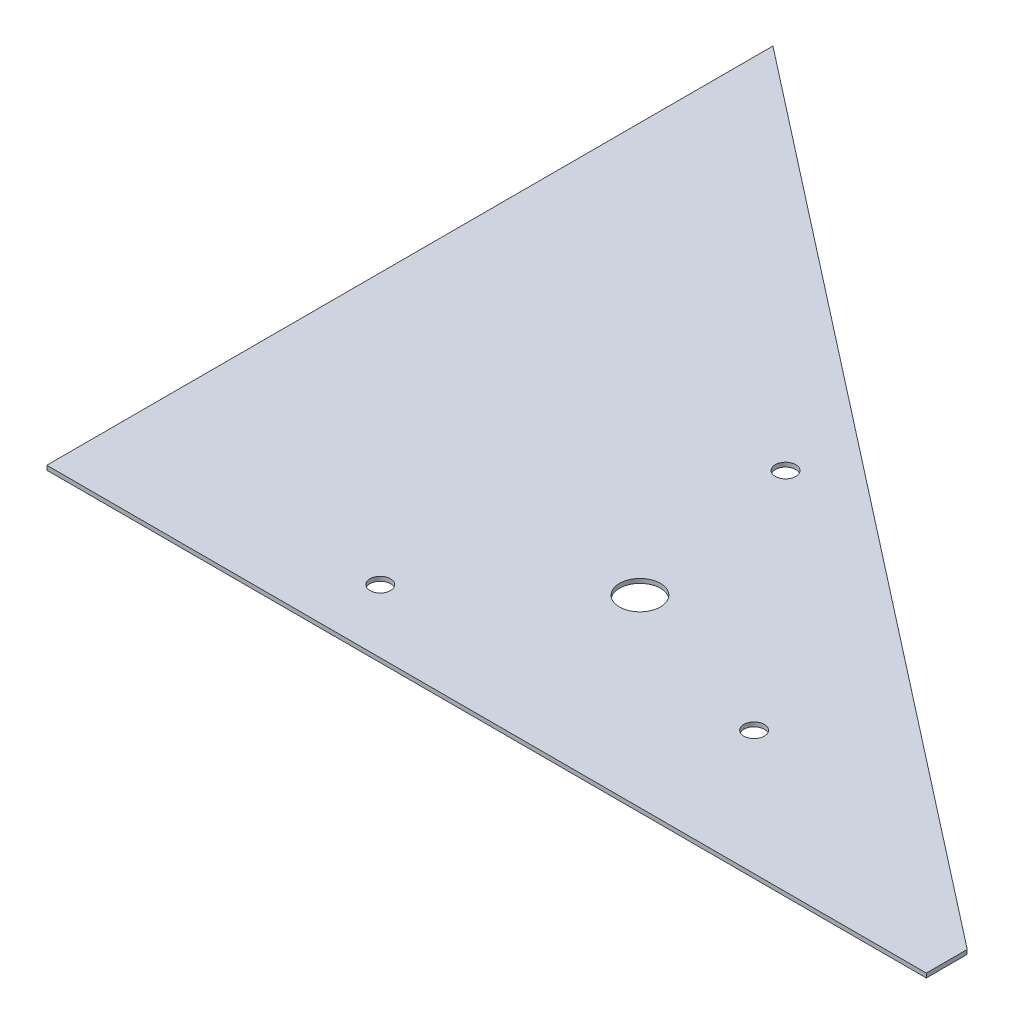
ISO-10303-21;
HEADER;
FILE_DESCRIPTION(('STEP AP214'),'2;1');
FILE_NAME('part.step','',(''),(''),'','','');
FILE_SCHEMA(('AUTOMOTIVE_DESIGN { 1 0 10303 214 1 1 1 1 }'));
ENDSEC;
DATA;
#1=APPLICATION_CONTEXT('core data for automotive mechanical design processes');
#2=APPLICATION_PROTOCOL_DEFINITION('international standard','automotive_design',2000,#1);
#3=PRODUCT_CONTEXT('',#1,'mechanical');
#4=PRODUCT('Part','Part','',(#3));
#5=PRODUCT_RELATED_PRODUCT_CATEGORY('part','',(#4));
#6=PRODUCT_DEFINITION_FORMATION('','',#4);
#7=PRODUCT_DEFINITION_CONTEXT('part definition',#1,'design');
#8=PRODUCT_DEFINITION('design','',#6,#7);
#9=PRODUCT_DEFINITION_SHAPE('','',#8);
#10=(LENGTH_UNIT() NAMED_UNIT(*) SI_UNIT(.MILLI.,.METRE.));
#11=(NAMED_UNIT(*) PLANE_ANGLE_UNIT() SI_UNIT($,.RADIAN.));
#12=(NAMED_UNIT(*) SI_UNIT($,.STERADIAN.) SOLID_ANGLE_UNIT());
#13=UNCERTAINTY_MEASURE_WITH_UNIT(LENGTH_MEASURE(1.E-05),#10,'distance_accuracy_value','');
#14=(GEOMETRIC_REPRESENTATION_CONTEXT(3) GLOBAL_UNCERTAINTY_ASSIGNED_CONTEXT((#13)) GLOBAL_UNIT_ASSIGNED_CONTEXT((#10,
#11,#12)) REPRESENTATION_CONTEXT('',''));
#15=CARTESIAN_POINT('',(0.,0.,0.));
#16=DIRECTION('',(0.,0.,1.));
#17=DIRECTION('',(1.,0.,0.));
#18=AXIS2_PLACEMENT_3D('',#15,#16,#17);
#19=CARTESIAN_POINT('',(546.1,2.65684,-25.4));
#20=DIRECTION('',(-0.614575452616154,0.,0.788858043656556));
#21=DIRECTION('',(0.788858043656556,0.,0.614575452616154));
#22=AXIS2_PLACEMENT_3D('',#19,#20,#21);
#23=PLANE('',#22);
#24=DIRECTION('',(-0.788858043656556,0.,-0.614575452616154));
#25=VECTOR('',#24,1.);
#26=CARTESIAN_POINT('',(546.1,0.,-25.4));
#27=LINE('',#26,#25);
#28=CARTESIAN_POINT('',(546.1,0.,-25.4));
#29=VERTEX_POINT('',#28);
#30=CARTESIAN_POINT('',(0.,0.,-450.85));
#31=VERTEX_POINT('',#30);
#32=EDGE_CURVE('E109',#29,#31,#27,.T.);
#33=ORIENTED_EDGE('',*,*,#32,.T.);
#34=DIRECTION('',(0.,-1.,0.));
#35=VECTOR('',#34,1.);
#36=CARTESIAN_POINT('',(0.,2.65684,-450.85));
#37=LINE('',#36,#35);
#38=CARTESIAN_POINT('',(0.,2.65684,-450.85));
#39=VERTEX_POINT('',#38);
#40=EDGE_CURVE('E11',#39,#31,#37,.T.);
#41=ORIENTED_EDGE('',*,*,#40,.F.);
#42=DIRECTION('',(-0.788858043656556,0.,-0.614575452616154));
#43=VECTOR('',#42,1.);
#44=CARTESIAN_POINT('',(546.1,2.65684,-25.4));
#45=LINE('',#44,#43);
#46=CARTESIAN_POINT('',(546.1,2.65684,-25.4));
#47=VERTEX_POINT('',#46);
#48=EDGE_CURVE('E93',#47,#39,#45,.T.);
#49=ORIENTED_EDGE('',*,*,#48,.F.);
#50=DIRECTION('',(0.,-1.,0.));
#51=VECTOR('',#50,1.);
#52=CARTESIAN_POINT('',(546.1,2.65684,-25.4));
#53=LINE('',#52,#51);
#54=EDGE_CURVE('E105',#47,#29,#53,.T.);
#55=ORIENTED_EDGE('',*,*,#54,.T.);
#56=EDGE_LOOP('',(#33,#41,#49,#55));
#57=FACE_BOUND('',#56,.T.);
#58=ADVANCED_FACE('F39',(#57),#23,.F.);
#59=CARTESIAN_POINT('',(0.,2.65684,-450.85));
#60=DIRECTION('',(1.,0.,0.));
#61=DIRECTION('',(0.,0.,-1.));
#62=AXIS2_PLACEMENT_3D('',#59,#60,#61);
#63=PLANE('',#62);
#64=DIRECTION('',(0.,0.,1.));
#65=VECTOR('',#64,1.);
#66=CARTESIAN_POINT('',(0.,0.,-450.85));
#67=LINE('',#66,#65);
#68=CARTESIAN_POINT('',(0.,0.,0.));
#69=VERTEX_POINT('',#68);
#70=EDGE_CURVE('E98',#31,#69,#67,.T.);
#71=ORIENTED_EDGE('',*,*,#70,.T.);
#72=DIRECTION('',(0.,-1.,0.));
#73=VECTOR('',#72,1.);
#74=CARTESIAN_POINT('',(0.,2.65684,0.));
#75=LINE('',#74,#73);
#76=CARTESIAN_POINT('',(0.,2.65684,0.));
#77=VERTEX_POINT('',#76);
#78=EDGE_CURVE('E48',#77,#69,#75,.T.);
#79=ORIENTED_EDGE('',*,*,#78,.F.);
#80=DIRECTION('',(0.,0.,1.));
#81=VECTOR('',#80,1.);
#82=CARTESIAN_POINT('',(0.,2.65684,-450.85));
#83=LINE('',#82,#81);
#84=EDGE_CURVE('E88',#39,#77,#83,.T.);
#85=ORIENTED_EDGE('',*,*,#84,.F.);
#86=ORIENTED_EDGE('',*,*,#40,.T.);
#87=EDGE_LOOP('',(#71,#79,#85,#86));
#88=FACE_BOUND('',#87,.T.);
#89=ADVANCED_FACE('F97',(#88),#63,.F.);
#90=CARTESIAN_POINT('',(0.,2.65684,0.));
#91=DIRECTION('',(0.,0.,-1.));
#92=DIRECTION('',(-1.,0.,0.));
#93=AXIS2_PLACEMENT_3D('',#90,#91,#92);
#94=PLANE('',#93);
#95=DIRECTION('',(1.,0.,0.));
#96=VECTOR('',#95,1.);
#97=CARTESIAN_POINT('',(0.,0.,0.));
#98=LINE('',#97,#96);
#99=CARTESIAN_POINT('',(546.1,0.,0.));
#100=VERTEX_POINT('',#99);
#101=EDGE_CURVE('E74',#69,#100,#98,.T.);
#102=ORIENTED_EDGE('',*,*,#101,.T.);
#103=DIRECTION('',(0.,-1.,0.));
#104=VECTOR('',#103,1.);
#105=CARTESIAN_POINT('',(546.1,2.65684,0.));
#106=LINE('',#105,#104);
#107=CARTESIAN_POINT('',(546.1,2.65684,0.));
#108=VERTEX_POINT('',#107);
#109=EDGE_CURVE('E99',#108,#100,#106,.T.);
#110=ORIENTED_EDGE('',*,*,#109,.F.);
#111=DIRECTION('',(1.,0.,0.));
#112=VECTOR('',#111,1.);
#113=CARTESIAN_POINT('',(0.,2.65684,0.));
#114=LINE('',#113,#112);
#115=EDGE_CURVE('E91',#77,#108,#114,.T.);
#116=ORIENTED_EDGE('',*,*,#115,.F.);
#117=ORIENTED_EDGE('',*,*,#78,.T.);
#118=EDGE_LOOP('',(#102,#110,#116,#117));
#119=FACE_BOUND('',#118,.T.);
#120=ADVANCED_FACE('F100',(#119),#94,.F.);
#121=CARTESIAN_POINT('',(546.1,2.65684,0.));
#122=DIRECTION('',(-1.,0.,0.));
#123=DIRECTION('',(0.,0.,1.));
#124=AXIS2_PLACEMENT_3D('',#121,#122,#123);
#125=PLANE('',#124);
#126=DIRECTION('',(0.,0.,-1.));
#127=VECTOR('',#126,1.);
#128=CARTESIAN_POINT('',(546.1,0.,0.));
#129=LINE('',#128,#127);
#130=EDGE_CURVE('E80',#100,#29,#129,.T.);
#131=ORIENTED_EDGE('',*,*,#130,.T.);
#132=ORIENTED_EDGE('',*,*,#54,.F.);
#133=DIRECTION('',(0.,0.,-1.));
#134=VECTOR('',#133,1.);
#135=CARTESIAN_POINT('',(546.1,2.65684,0.));
#136=LINE('',#135,#134);
#137=EDGE_CURVE('E56',#108,#47,#136,.T.);
#138=ORIENTED_EDGE('',*,*,#137,.F.);
#139=ORIENTED_EDGE('',*,*,#109,.T.);
#140=EDGE_LOOP('',(#131,#132,#138,#139));
#141=FACE_BOUND('',#140,.T.);
#142=ADVANCED_FACE('F119',(#141),#125,.F.);
#143=CARTESIAN_POINT('',(0.,2.65684,0.));
#144=DIRECTION('',(0.,1.,0.));
#145=DIRECTION('',(0.,0.,1.));
#146=AXIS2_PLACEMENT_3D('',#143,#144,#145);
#147=PLANE('',#146);
#148=CARTESIAN_POINT('',(232.190531828462,2.65684,-226.499987068068));
#149=DIRECTION('',(0.,1.,0.));
#150=DIRECTION('',(0.,0.,1.));
#151=AXIS2_PLACEMENT_3D('',#148,#149,#150);
#152=CIRCLE('',#151,6.34999999999998);
#153=CARTESIAN_POINT('',(232.190531828462,2.65684,-220.149987068068));
#154=VERTEX_POINT('',#153);
#155=EDGE_CURVE('E150',#154,#154,#152,.T.);
#156=ORIENTED_EDGE('',*,*,#155,.F.);
#157=EDGE_LOOP('',(#156));
#158=FACE_BOUND('',#157,.T.);
#159=CARTESIAN_POINT('',(167.736694980537,2.65684,-39.3124529863857));
#160=DIRECTION('',(0.,1.,0.));
#161=DIRECTION('',(0.,0.,1.));
#162=AXIS2_PLACEMENT_3D('',#159,#160,#161);
#163=CIRCLE('',#162,6.35000000000006);
#164=CARTESIAN_POINT('',(167.736694980537,2.65684,-32.9624529863856));
#165=VERTEX_POINT('',#164);
#166=EDGE_CURVE('E142',#165,#165,#163,.T.);
#167=ORIENTED_EDGE('',*,*,#166,.F.);
#168=EDGE_LOOP('',(#167));
#169=FACE_BOUND('',#168,.T.);
#170=CARTESIAN_POINT('',(362.072773191002,2.65684,-77.087559945547));
#171=DIRECTION('',(0.,1.,0.));
#172=DIRECTION('',(0.,0.,1.));
#173=AXIS2_PLACEMENT_3D('',#170,#171,#172);
#174=CIRCLE('',#173,6.35);
#175=CARTESIAN_POINT('',(362.072773191002,2.65684,-70.737559945547));
#176=VERTEX_POINT('',#175);
#177=EDGE_CURVE('E135',#176,#176,#174,.T.);
#178=ORIENTED_EDGE('',*,*,#177,.F.);
#179=EDGE_LOOP('',(#178));
#180=FACE_BOUND('',#179,.T.);
#181=CARTESIAN_POINT('',(254.,2.65684,-114.3));
#182=DIRECTION('',(0.,-1.,0.));
#183=DIRECTION('',(0.,0.,-1.));
#184=AXIS2_PLACEMENT_3D('',#181,#182,#183);
#185=CIRCLE('',#184,12.7);
#186=CARTESIAN_POINT('',(254.,2.65684,-127.));
#187=VERTEX_POINT('',#186);
#188=EDGE_CURVE('E113',#187,#187,#185,.T.);
#189=ORIENTED_EDGE('',*,*,#188,.T.);
#190=EDGE_LOOP('',(#189));
#191=FACE_BOUND('',#190,.T.);
#192=ORIENTED_EDGE('',*,*,#48,.T.);
#193=ORIENTED_EDGE('',*,*,#84,.T.);
#194=ORIENTED_EDGE('',*,*,#115,.T.);
#195=ORIENTED_EDGE('',*,*,#137,.T.);
#196=EDGE_LOOP('',(#192,#193,#194,#195));
#197=FACE_BOUND('',#196,.T.);
#198=ADVANCED_FACE('F89',(#158,#169,#180,#191,#197),#147,.T.);
#199=CARTESIAN_POINT('',(0.,0.,0.));
#200=DIRECTION('',(0.,1.,0.));
#201=DIRECTION('',(0.,0.,1.));
#202=AXIS2_PLACEMENT_3D('',#199,#200,#201);
#203=PLANE('',#202);
#204=CARTESIAN_POINT('',(232.190531828462,0.,-226.499987068068));
#205=DIRECTION('',(0.,1.,0.));
#206=DIRECTION('',(0.,0.,1.));
#207=AXIS2_PLACEMENT_3D('',#204,#205,#206);
#208=CIRCLE('',#207,6.34999999999998);
#209=CARTESIAN_POINT('',(232.190531828462,0.,-220.149987068068));
#210=VERTEX_POINT('',#209);
#211=EDGE_CURVE('E146',#210,#210,#208,.T.);
#212=ORIENTED_EDGE('',*,*,#211,.T.);
#213=EDGE_LOOP('',(#212));
#214=FACE_BOUND('',#213,.T.);
#215=CARTESIAN_POINT('',(167.736694980537,0.,-39.3124529863857));
#216=DIRECTION('',(0.,1.,0.));
#217=DIRECTION('',(0.,0.,1.));
#218=AXIS2_PLACEMENT_3D('',#215,#216,#217);
#219=CIRCLE('',#218,6.35000000000006);
#220=CARTESIAN_POINT('',(167.736694980537,0.,-32.9624529863856));
#221=VERTEX_POINT('',#220);
#222=EDGE_CURVE('E139',#221,#221,#219,.T.);
#223=ORIENTED_EDGE('',*,*,#222,.T.);
#224=EDGE_LOOP('',(#223));
#225=FACE_BOUND('',#224,.T.);
#226=CARTESIAN_POINT('',(362.072773191002,0.,-77.087559945547));
#227=DIRECTION('',(0.,1.,0.));
#228=DIRECTION('',(0.,0.,1.));
#229=AXIS2_PLACEMENT_3D('',#226,#227,#228);
#230=CIRCLE('',#229,6.35);
#231=CARTESIAN_POINT('',(362.072773191002,0.,-70.737559945547));
#232=VERTEX_POINT('',#231);
#233=EDGE_CURVE('E131',#232,#232,#230,.T.);
#234=ORIENTED_EDGE('',*,*,#233,.T.);
#235=EDGE_LOOP('',(#234));
#236=FACE_BOUND('',#235,.T.);
#237=CARTESIAN_POINT('',(254.,0.,-114.3));
#238=DIRECTION('',(0.,-1.,0.));
#239=DIRECTION('',(0.,0.,-1.));
#240=AXIS2_PLACEMENT_3D('',#237,#238,#239);
#241=CIRCLE('',#240,12.7);
#242=CARTESIAN_POINT('',(254.,0.,-127.));
#243=VERTEX_POINT('',#242);
#244=EDGE_CURVE('E127',#243,#243,#241,.T.);
#245=ORIENTED_EDGE('',*,*,#244,.F.);
#246=EDGE_LOOP('',(#245));
#247=FACE_BOUND('',#246,.T.);
#248=ORIENTED_EDGE('',*,*,#32,.F.);
#249=ORIENTED_EDGE('',*,*,#130,.F.);
#250=ORIENTED_EDGE('',*,*,#101,.F.);
#251=ORIENTED_EDGE('',*,*,#70,.F.);
#252=EDGE_LOOP('',(#248,#249,#250,#251));
#253=FACE_BOUND('',#252,.T.);
#254=ADVANCED_FACE('F122',(#214,#225,#236,#247,#253),#203,.F.);
#255=CARTESIAN_POINT('',(254.,2.65684,-114.3));
#256=DIRECTION('',(0.,-1.,0.));
#257=DIRECTION('',(0.,0.,-1.));
#258=AXIS2_PLACEMENT_3D('',#255,#256,#257);
#259=CYLINDRICAL_SURFACE('',#258,12.7);
#260=CARTESIAN_POINT('',(254.,2.65684,-127.));
#261=CARTESIAN_POINT('',(254.,2.62916458333333,-127.));
#262=CARTESIAN_POINT('',(254.,2.60148916666667,-127.));
#263=CARTESIAN_POINT('',(254.,2.54613833333333,-127.));
#264=CARTESIAN_POINT('',(254.,2.51846291666667,-127.));
#265=CARTESIAN_POINT('',(254.,2.46311208333333,-127.));
#266=CARTESIAN_POINT('',(254.,2.43543666666667,-127.));
#267=CARTESIAN_POINT('',(254.,2.38008583333333,-127.));
#268=CARTESIAN_POINT('',(254.,2.35241041666667,-127.));
#269=CARTESIAN_POINT('',(254.,2.29705958333333,-127.));
#270=CARTESIAN_POINT('',(254.,2.26938416666667,-127.));
#271=CARTESIAN_POINT('',(254.,2.21403333333333,-127.));
#272=CARTESIAN_POINT('',(254.,2.18635791666667,-127.));
#273=CARTESIAN_POINT('',(254.,2.13100708333333,-127.));
#274=CARTESIAN_POINT('',(254.,2.10333166666667,-127.));
#275=CARTESIAN_POINT('',(254.,2.04798083333333,-127.));
#276=CARTESIAN_POINT('',(254.,2.02030541666667,-127.));
#277=CARTESIAN_POINT('',(254.,1.96495458333333,-127.));
#278=CARTESIAN_POINT('',(254.,1.93727916666667,-127.));
#279=CARTESIAN_POINT('',(254.,1.88192833333333,-127.));
#280=CARTESIAN_POINT('',(254.,1.85425291666667,-127.));
#281=CARTESIAN_POINT('',(254.,1.79890208333333,-127.));
#282=CARTESIAN_POINT('',(254.,1.77122666666667,-127.));
#283=CARTESIAN_POINT('',(254.,1.71587583333333,-127.));
#284=CARTESIAN_POINT('',(254.,1.68820041666667,-127.));
#285=CARTESIAN_POINT('',(254.,1.63284958333333,-127.));
#286=CARTESIAN_POINT('',(254.,1.60517416666667,-127.));
#287=CARTESIAN_POINT('',(254.,1.54982333333333,-127.));
#288=CARTESIAN_POINT('',(254.,1.52214791666667,-127.));
#289=CARTESIAN_POINT('',(254.,1.46679708333333,-127.));
#290=CARTESIAN_POINT('',(254.,1.43912166666667,-127.));
#291=CARTESIAN_POINT('',(254.,1.38377083333333,-127.));
#292=CARTESIAN_POINT('',(254.,1.35609541666667,-127.));
#293=CARTESIAN_POINT('',(254.,1.30074458333333,-127.));
#294=CARTESIAN_POINT('',(254.,1.27306916666667,-127.));
#295=CARTESIAN_POINT('',(254.,1.21771833333333,-127.));
#296=CARTESIAN_POINT('',(254.,1.19004291666667,-127.));
#297=CARTESIAN_POINT('',(254.,1.13469208333333,-127.));
#298=CARTESIAN_POINT('',(254.,1.10701666666667,-127.));
#299=CARTESIAN_POINT('',(254.,1.05166583333333,-127.));
#300=CARTESIAN_POINT('',(254.,1.02399041666667,-127.));
#301=CARTESIAN_POINT('',(254.,0.968639583333334,-127.));
#302=CARTESIAN_POINT('',(254.,0.940964166666667,-127.));
#303=CARTESIAN_POINT('',(254.,0.885613333333334,-127.));
#304=CARTESIAN_POINT('',(254.,0.857937916666667,-127.));
#305=CARTESIAN_POINT('',(254.,0.802587083333334,-127.));
#306=CARTESIAN_POINT('',(254.,0.774911666666667,-127.));
#307=CARTESIAN_POINT('',(254.,0.719560833333334,-127.));
#308=CARTESIAN_POINT('',(254.,0.691885416666667,-127.));
#309=CARTESIAN_POINT('',(254.,0.636534583333334,-127.));
#310=CARTESIAN_POINT('',(254.,0.608859166666667,-127.));
#311=CARTESIAN_POINT('',(254.,0.553508333333334,-127.));
#312=CARTESIAN_POINT('',(254.,0.525832916666667,-127.));
#313=CARTESIAN_POINT('',(254.,0.470482083333334,-127.));
#314=CARTESIAN_POINT('',(254.,0.442806666666667,-127.));
#315=CARTESIAN_POINT('',(254.,0.387455833333334,-127.));
#316=CARTESIAN_POINT('',(254.,0.359780416666667,-127.));
#317=CARTESIAN_POINT('',(254.,0.304429583333334,-127.));
#318=CARTESIAN_POINT('',(254.,0.276754166666667,-127.));
#319=CARTESIAN_POINT('',(254.,0.221403333333334,-127.));
#320=CARTESIAN_POINT('',(254.,0.193727916666667,-127.));
#321=CARTESIAN_POINT('',(254.,0.138377083333334,-127.));
#322=CARTESIAN_POINT('',(254.,0.110701666666667,-127.));
#323=CARTESIAN_POINT('',(254.,0.0553508333333336,-127.));
#324=CARTESIAN_POINT('',(254.,0.027675416666667,-127.));
#325=CARTESIAN_POINT('',(254.,0.,-127.));
#326=B_SPLINE_CURVE_WITH_KNOTS('',3,(#260,#261,#262,#263,#264,#265,#266,#267,#268,#269,#270,
#271,#272,#273,#274,#275,#276,#277,#278,#279,#280,#281,#282,#283,#284,#285,#286,#287,#288,#289,
#290,#291,#292,#293,#294,#295,#296,#297,#298,#299,#300,#301,#302,#303,#304,#305,#306,#307,#308,
#309,#310,#311,#312,#313,#314,#315,#316,#317,#318,#319,#320,#321,#322,#323,#324,#325),
.UNSPECIFIED.,.F.,.F.,(4,2,2,2,2,2,2,2,2,2,2,2,2,2,2,2,2,2,2,2,2,2,2,2,2,2,2,2,2,2,2,2,4),(0.,
0.0830262499999998,0.1660525,0.24907875,0.332105,0.41513125,0.4981575,0.581183749999999,0.66421,
0.747236249999999,0.8302625,0.91328875,0.996314999999999,1.07934125,1.1623675,1.24539375,
1.32842,1.41144625,1.4944725,1.57749875,1.660525,1.74355125,1.8265775,1.90960375,1.99263,
2.07565625,2.1586825,2.24170875,2.324735,2.40776125,2.4907875,2.57381375,2.65684),.UNSPECIFIED.);
#327=EDGE_CURVE('BSEAM175',#187,#243,#326,.T.);
#328=ORIENTED_EDGE('',*,*,#188,.F.);
#329=ORIENTED_EDGE('',*,*,#244,.T.);
#330=ORIENTED_EDGE('',*,*,#327,.T.);
#331=ORIENTED_EDGE('',*,*,#327,.F.);
#332=EDGE_LOOP('',(#328,#330,#329,#331));
#333=FACE_BOUND('',#332,.T.);
#334=ADVANCED_FACE('F175',(#333),#259,.F.);
#335=CARTESIAN_POINT('',(362.072773191002,0.,-77.087559945547));
#336=DIRECTION('',(0.,1.,0.));
#337=DIRECTION('',(0.,0.,1.));
#338=AXIS2_PLACEMENT_3D('',#335,#336,#337);
#339=CYLINDRICAL_SURFACE('',#338,6.35);
#340=CARTESIAN_POINT('',(362.072773191002,0.,-70.737559945547));
#341=CARTESIAN_POINT('',(362.072773191002,0.0276754166666666,-70.737559945547));
#342=CARTESIAN_POINT('',(362.072773191002,0.0553508333333333,-70.737559945547));
#343=CARTESIAN_POINT('',(362.072773191002,0.110701666666667,-70.737559945547));
#344=CARTESIAN_POINT('',(362.072773191002,0.138377083333333,-70.737559945547));
#345=CARTESIAN_POINT('',(362.072773191002,0.193727916666667,-70.737559945547));
#346=CARTESIAN_POINT('',(362.072773191002,0.221403333333333,-70.737559945547));
#347=CARTESIAN_POINT('',(362.072773191002,0.276754166666667,-70.737559945547));
#348=CARTESIAN_POINT('',(362.072773191002,0.304429583333333,-70.737559945547));
#349=CARTESIAN_POINT('',(362.072773191002,0.359780416666667,-70.737559945547));
#350=CARTESIAN_POINT('',(362.072773191002,0.387455833333333,-70.737559945547));
#351=CARTESIAN_POINT('',(362.072773191002,0.442806666666667,-70.737559945547));
#352=CARTESIAN_POINT('',(362.072773191002,0.470482083333333,-70.737559945547));
#353=CARTESIAN_POINT('',(362.072773191002,0.525832916666666,-70.737559945547));
#354=CARTESIAN_POINT('',(362.072773191002,0.553508333333333,-70.737559945547));
#355=CARTESIAN_POINT('',(362.072773191002,0.608859166666667,-70.737559945547));
#356=CARTESIAN_POINT('',(362.072773191002,0.636534583333333,-70.737559945547));
#357=CARTESIAN_POINT('',(362.072773191002,0.691885416666666,-70.737559945547));
#358=CARTESIAN_POINT('',(362.072773191002,0.719560833333333,-70.737559945547));
#359=CARTESIAN_POINT('',(362.072773191002,0.774911666666667,-70.737559945547));
#360=CARTESIAN_POINT('',(362.072773191002,0.802587083333333,-70.737559945547));
#361=CARTESIAN_POINT('',(362.072773191002,0.857937916666667,-70.737559945547));
#362=CARTESIAN_POINT('',(362.072773191002,0.885613333333333,-70.737559945547));
#363=CARTESIAN_POINT('',(362.072773191002,0.940964166666666,-70.737559945547));
#364=CARTESIAN_POINT('',(362.072773191002,0.968639583333333,-70.737559945547));
#365=CARTESIAN_POINT('',(362.072773191002,1.02399041666667,-70.737559945547));
#366=CARTESIAN_POINT('',(362.072773191002,1.05166583333333,-70.737559945547));
#367=CARTESIAN_POINT('',(362.072773191002,1.10701666666667,-70.737559945547));
#368=CARTESIAN_POINT('',(362.072773191002,1.13469208333333,-70.737559945547));
#369=CARTESIAN_POINT('',(362.072773191002,1.19004291666667,-70.737559945547));
#370=CARTESIAN_POINT('',(362.072773191002,1.21771833333333,-70.737559945547));
#371=CARTESIAN_POINT('',(362.072773191002,1.27306916666667,-70.737559945547));
#372=CARTESIAN_POINT('',(362.072773191002,1.30074458333333,-70.737559945547));
#373=CARTESIAN_POINT('',(362.072773191002,1.35609541666667,-70.737559945547));
#374=CARTESIAN_POINT('',(362.072773191002,1.38377083333333,-70.737559945547));
#375=CARTESIAN_POINT('',(362.072773191002,1.43912166666667,-70.737559945547));
#376=CARTESIAN_POINT('',(362.072773191002,1.46679708333333,-70.737559945547));
#377=CARTESIAN_POINT('',(362.072773191002,1.52214791666667,-70.737559945547));
#378=CARTESIAN_POINT('',(362.072773191002,1.54982333333333,-70.737559945547));
#379=CARTESIAN_POINT('',(362.072773191002,1.60517416666667,-70.737559945547));
#380=CARTESIAN_POINT('',(362.072773191002,1.63284958333333,-70.737559945547));
#381=CARTESIAN_POINT('',(362.072773191002,1.68820041666667,-70.737559945547));
#382=CARTESIAN_POINT('',(362.072773191002,1.71587583333333,-70.737559945547));
#383=CARTESIAN_POINT('',(362.072773191002,1.77122666666667,-70.737559945547));
#384=CARTESIAN_POINT('',(362.072773191002,1.79890208333333,-70.737559945547));
#385=CARTESIAN_POINT('',(362.072773191002,1.85425291666667,-70.737559945547));
#386=CARTESIAN_POINT('',(362.072773191002,1.88192833333333,-70.737559945547));
#387=CARTESIAN_POINT('',(362.072773191002,1.93727916666667,-70.737559945547));
#388=CARTESIAN_POINT('',(362.072773191002,1.96495458333333,-70.737559945547));
#389=CARTESIAN_POINT('',(362.072773191002,2.02030541666667,-70.737559945547));
#390=CARTESIAN_POINT('',(362.072773191002,2.04798083333333,-70.737559945547));
#391=CARTESIAN_POINT('',(362.072773191002,2.10333166666667,-70.737559945547));
#392=CARTESIAN_POINT('',(362.072773191002,2.13100708333333,-70.737559945547));
#393=CARTESIAN_POINT('',(362.072773191002,2.18635791666667,-70.737559945547));
#394=CARTESIAN_POINT('',(362.072773191002,2.21403333333333,-70.737559945547));
#395=CARTESIAN_POINT('',(362.072773191002,2.26938416666667,-70.737559945547));
#396=CARTESIAN_POINT('',(362.072773191002,2.29705958333333,-70.737559945547));
#397=CARTESIAN_POINT('',(362.072773191002,2.35241041666667,-70.737559945547));
#398=CARTESIAN_POINT('',(362.072773191002,2.38008583333333,-70.737559945547));
#399=CARTESIAN_POINT('',(362.072773191002,2.43543666666667,-70.737559945547));
#400=CARTESIAN_POINT('',(362.072773191002,2.46311208333333,-70.737559945547));
#401=CARTESIAN_POINT('',(362.072773191002,2.51846291666667,-70.737559945547));
#402=CARTESIAN_POINT('',(362.072773191002,2.54613833333333,-70.737559945547));
#403=CARTESIAN_POINT('',(362.072773191002,2.60148916666667,-70.737559945547));
#404=CARTESIAN_POINT('',(362.072773191002,2.62916458333333,-70.737559945547));
#405=CARTESIAN_POINT('',(362.072773191002,2.65684,-70.737559945547));
#406=B_SPLINE_CURVE_WITH_KNOTS('',3,(#340,#341,#342,#343,#344,#345,#346,#347,#348,#349,#350,
#351,#352,#353,#354,#355,#356,#357,#358,#359,#360,#361,#362,#363,#364,#365,#366,#367,#368,#369,
#370,#371,#372,#373,#374,#375,#376,#377,#378,#379,#380,#381,#382,#383,#384,#385,#386,#387,#388,
#389,#390,#391,#392,#393,#394,#395,#396,#397,#398,#399,#400,#401,#402,#403,#404,#405),
.UNSPECIFIED.,.F.,.F.,(4,2,2,2,2,2,2,2,2,2,2,2,2,2,2,2,2,2,2,2,2,2,2,2,2,2,2,2,2,2,2,2,4),(0.,
0.08302625,0.1660525,0.24907875,0.332105,0.41513125,0.4981575,0.58118375,0.66421,0.74723625,
0.8302625,0.91328875,0.996315,1.07934125,1.1623675,1.24539375,1.32842,1.41144625,1.4944725,
1.57749875,1.660525,1.74355125,1.8265775,1.90960375,1.99263,2.07565625,2.1586825,2.24170875,
2.324735,2.40776125,2.4907875,2.57381375,2.65684),.UNSPECIFIED.);
#407=EDGE_CURVE('BSEAM178',#232,#176,#406,.T.);
#408=ORIENTED_EDGE('',*,*,#233,.F.);
#409=ORIENTED_EDGE('',*,*,#177,.T.);
#410=ORIENTED_EDGE('',*,*,#407,.T.);
#411=ORIENTED_EDGE('',*,*,#407,.F.);
#412=EDGE_LOOP('',(#408,#410,#409,#411));
#413=FACE_BOUND('',#412,.T.);
#414=ADVANCED_FACE('F178',(#413),#339,.F.);
#415=CARTESIAN_POINT('',(167.736694980537,0.,-39.3124529863857));
#416=DIRECTION('',(0.,1.,0.));
#417=DIRECTION('',(0.,0.,1.));
#418=AXIS2_PLACEMENT_3D('',#415,#416,#417);
#419=CYLINDRICAL_SURFACE('',#418,6.35000000000006);
#420=CARTESIAN_POINT('',(167.736694980537,0.,-32.9624529863856));
#421=CARTESIAN_POINT('',(167.736694980537,0.0276754166666666,-32.9624529863856));
#422=CARTESIAN_POINT('',(167.736694980537,0.0553508333333333,-32.9624529863856));
#423=CARTESIAN_POINT('',(167.736694980537,0.110701666666667,-32.9624529863856));
#424=CARTESIAN_POINT('',(167.736694980537,0.138377083333333,-32.9624529863856));
#425=CARTESIAN_POINT('',(167.736694980537,0.193727916666667,-32.9624529863856));
#426=CARTESIAN_POINT('',(167.736694980537,0.221403333333333,-32.9624529863856));
#427=CARTESIAN_POINT('',(167.736694980537,0.276754166666667,-32.9624529863856));
#428=CARTESIAN_POINT('',(167.736694980537,0.304429583333333,-32.9624529863856));
#429=CARTESIAN_POINT('',(167.736694980537,0.359780416666667,-32.9624529863856));
#430=CARTESIAN_POINT('',(167.736694980537,0.387455833333333,-32.9624529863856));
#431=CARTESIAN_POINT('',(167.736694980537,0.442806666666667,-32.9624529863856));
#432=CARTESIAN_POINT('',(167.736694980537,0.470482083333333,-32.9624529863856));
#433=CARTESIAN_POINT('',(167.736694980537,0.525832916666666,-32.9624529863856));
#434=CARTESIAN_POINT('',(167.736694980537,0.553508333333333,-32.9624529863856));
#435=CARTESIAN_POINT('',(167.736694980537,0.608859166666667,-32.9624529863856));
#436=CARTESIAN_POINT('',(167.736694980537,0.636534583333333,-32.9624529863856));
#437=CARTESIAN_POINT('',(167.736694980537,0.691885416666666,-32.9624529863856));
#438=CARTESIAN_POINT('',(167.736694980537,0.719560833333333,-32.9624529863856));
#439=CARTESIAN_POINT('',(167.736694980537,0.774911666666667,-32.9624529863856));
#440=CARTESIAN_POINT('',(167.736694980537,0.802587083333333,-32.9624529863856));
#441=CARTESIAN_POINT('',(167.736694980537,0.857937916666667,-32.9624529863856));
#442=CARTESIAN_POINT('',(167.736694980537,0.885613333333333,-32.9624529863856));
#443=CARTESIAN_POINT('',(167.736694980537,0.940964166666666,-32.9624529863856));
#444=CARTESIAN_POINT('',(167.736694980537,0.968639583333333,-32.9624529863856));
#445=CARTESIAN_POINT('',(167.736694980537,1.02399041666667,-32.9624529863856));
#446=CARTESIAN_POINT('',(167.736694980537,1.05166583333333,-32.9624529863856));
#447=CARTESIAN_POINT('',(167.736694980537,1.10701666666667,-32.9624529863856));
#448=CARTESIAN_POINT('',(167.736694980537,1.13469208333333,-32.9624529863856));
#449=CARTESIAN_POINT('',(167.736694980537,1.19004291666667,-32.9624529863856));
#450=CARTESIAN_POINT('',(167.736694980537,1.21771833333333,-32.9624529863856));
#451=CARTESIAN_POINT('',(167.736694980537,1.27306916666667,-32.9624529863856));
#452=CARTESIAN_POINT('',(167.736694980537,1.30074458333333,-32.9624529863856));
#453=CARTESIAN_POINT('',(167.736694980537,1.35609541666667,-32.9624529863856));
#454=CARTESIAN_POINT('',(167.736694980537,1.38377083333333,-32.9624529863856));
#455=CARTESIAN_POINT('',(167.736694980537,1.43912166666667,-32.9624529863856));
#456=CARTESIAN_POINT('',(167.736694980537,1.46679708333333,-32.9624529863856));
#457=CARTESIAN_POINT('',(167.736694980537,1.52214791666667,-32.9624529863856));
#458=CARTESIAN_POINT('',(167.736694980537,1.54982333333333,-32.9624529863856));
#459=CARTESIAN_POINT('',(167.736694980537,1.60517416666667,-32.9624529863856));
#460=CARTESIAN_POINT('',(167.736694980537,1.63284958333333,-32.9624529863856));
#461=CARTESIAN_POINT('',(167.736694980537,1.68820041666667,-32.9624529863856));
#462=CARTESIAN_POINT('',(167.736694980537,1.71587583333333,-32.9624529863856));
#463=CARTESIAN_POINT('',(167.736694980537,1.77122666666667,-32.9624529863856));
#464=CARTESIAN_POINT('',(167.736694980537,1.79890208333333,-32.9624529863856));
#465=CARTESIAN_POINT('',(167.736694980537,1.85425291666667,-32.9624529863856));
#466=CARTESIAN_POINT('',(167.736694980537,1.88192833333333,-32.9624529863856));
#467=CARTESIAN_POINT('',(167.736694980537,1.93727916666667,-32.9624529863856));
#468=CARTESIAN_POINT('',(167.736694980537,1.96495458333333,-32.9624529863856));
#469=CARTESIAN_POINT('',(167.736694980537,2.02030541666667,-32.9624529863856));
#470=CARTESIAN_POINT('',(167.736694980537,2.04798083333333,-32.9624529863856));
#471=CARTESIAN_POINT('',(167.736694980537,2.10333166666667,-32.9624529863856));
#472=CARTESIAN_POINT('',(167.736694980537,2.13100708333333,-32.9624529863856));
#473=CARTESIAN_POINT('',(167.736694980537,2.18635791666667,-32.9624529863856));
#474=CARTESIAN_POINT('',(167.736694980537,2.21403333333333,-32.9624529863856));
#475=CARTESIAN_POINT('',(167.736694980537,2.26938416666667,-32.9624529863856));
#476=CARTESIAN_POINT('',(167.736694980537,2.29705958333333,-32.9624529863856));
#477=CARTESIAN_POINT('',(167.736694980537,2.35241041666667,-32.9624529863856));
#478=CARTESIAN_POINT('',(167.736694980537,2.38008583333333,-32.9624529863856));
#479=CARTESIAN_POINT('',(167.736694980537,2.43543666666667,-32.9624529863856));
#480=CARTESIAN_POINT('',(167.736694980537,2.46311208333333,-32.9624529863856));
#481=CARTESIAN_POINT('',(167.736694980537,2.51846291666667,-32.9624529863856));
#482=CARTESIAN_POINT('',(167.736694980537,2.54613833333333,-32.9624529863856));
#483=CARTESIAN_POINT('',(167.736694980537,2.60148916666667,-32.9624529863856));
#484=CARTESIAN_POINT('',(167.736694980537,2.62916458333333,-32.9624529863856));
#485=CARTESIAN_POINT('',(167.736694980537,2.65684,-32.9624529863856));
#486=B_SPLINE_CURVE_WITH_KNOTS('',3,(#420,#421,#422,#423,#424,#425,#426,#427,#428,#429,#430,
#431,#432,#433,#434,#435,#436,#437,#438,#439,#440,#441,#442,#443,#444,#445,#446,#447,#448,#449,
#450,#451,#452,#453,#454,#455,#456,#457,#458,#459,#460,#461,#462,#463,#464,#465,#466,#467,#468,
#469,#470,#471,#472,#473,#474,#475,#476,#477,#478,#479,#480,#481,#482,#483,#484,#485),
.UNSPECIFIED.,.F.,.F.,(4,2,2,2,2,2,2,2,2,2,2,2,2,2,2,2,2,2,2,2,2,2,2,2,2,2,2,2,2,2,2,2,4),(0.,
0.08302625,0.1660525,0.24907875,0.332105,0.41513125,0.4981575,0.58118375,0.66421,0.74723625,
0.8302625,0.91328875,0.996315,1.07934125,1.1623675,1.24539375,1.32842,1.41144625,1.4944725,
1.57749875,1.660525,1.74355125,1.8265775,1.90960375,1.99263,2.07565625,2.1586825,2.24170875,
2.324735,2.40776125,2.4907875,2.57381375,2.65684),.UNSPECIFIED.);
#487=EDGE_CURVE('BSEAM162',#221,#165,#486,.T.);
#488=ORIENTED_EDGE('',*,*,#222,.F.);
#489=ORIENTED_EDGE('',*,*,#166,.T.);
#490=ORIENTED_EDGE('',*,*,#487,.T.);
#491=ORIENTED_EDGE('',*,*,#487,.F.);
#492=EDGE_LOOP('',(#488,#490,#489,#491));
#493=FACE_BOUND('',#492,.T.);
#494=ADVANCED_FACE('F162',(#493),#419,.F.);
#495=CARTESIAN_POINT('',(232.190531828462,0.,-226.499987068068));
#496=DIRECTION('',(0.,1.,0.));
#497=DIRECTION('',(0.,0.,1.));
#498=AXIS2_PLACEMENT_3D('',#495,#496,#497);
#499=CYLINDRICAL_SURFACE('',#498,6.34999999999998);
#500=CARTESIAN_POINT('',(232.190531828462,0.,-220.149987068068));
#501=CARTESIAN_POINT('',(232.190531828462,0.0276754166666666,-220.149987068068));
#502=CARTESIAN_POINT('',(232.190531828462,0.0553508333333333,-220.149987068068));
#503=CARTESIAN_POINT('',(232.190531828462,0.110701666666667,-220.149987068068));
#504=CARTESIAN_POINT('',(232.190531828462,0.138377083333333,-220.149987068068));
#505=CARTESIAN_POINT('',(232.190531828462,0.193727916666667,-220.149987068068));
#506=CARTESIAN_POINT('',(232.190531828462,0.221403333333333,-220.149987068068));
#507=CARTESIAN_POINT('',(232.190531828462,0.276754166666667,-220.149987068068));
#508=CARTESIAN_POINT('',(232.190531828462,0.304429583333333,-220.149987068068));
#509=CARTESIAN_POINT('',(232.190531828462,0.359780416666667,-220.149987068068));
#510=CARTESIAN_POINT('',(232.190531828462,0.387455833333333,-220.149987068068));
#511=CARTESIAN_POINT('',(232.190531828462,0.442806666666667,-220.149987068068));
#512=CARTESIAN_POINT('',(232.190531828462,0.470482083333333,-220.149987068068));
#513=CARTESIAN_POINT('',(232.190531828462,0.525832916666666,-220.149987068068));
#514=CARTESIAN_POINT('',(232.190531828462,0.553508333333333,-220.149987068068));
#515=CARTESIAN_POINT('',(232.190531828462,0.608859166666667,-220.149987068068));
#516=CARTESIAN_POINT('',(232.190531828462,0.636534583333333,-220.149987068068));
#517=CARTESIAN_POINT('',(232.190531828462,0.691885416666666,-220.149987068068));
#518=CARTESIAN_POINT('',(232.190531828462,0.719560833333333,-220.149987068068));
#519=CARTESIAN_POINT('',(232.190531828462,0.774911666666667,-220.149987068068));
#520=CARTESIAN_POINT('',(232.190531828462,0.802587083333333,-220.149987068068));
#521=CARTESIAN_POINT('',(232.190531828462,0.857937916666667,-220.149987068068));
#522=CARTESIAN_POINT('',(232.190531828462,0.885613333333333,-220.149987068068));
#523=CARTESIAN_POINT('',(232.190531828462,0.940964166666666,-220.149987068068));
#524=CARTESIAN_POINT('',(232.190531828462,0.968639583333333,-220.149987068068));
#525=CARTESIAN_POINT('',(232.190531828462,1.02399041666667,-220.149987068068));
#526=CARTESIAN_POINT('',(232.190531828462,1.05166583333333,-220.149987068068));
#527=CARTESIAN_POINT('',(232.190531828462,1.10701666666667,-220.149987068068));
#528=CARTESIAN_POINT('',(232.190531828462,1.13469208333333,-220.149987068068));
#529=CARTESIAN_POINT('',(232.190531828462,1.19004291666667,-220.149987068068));
#530=CARTESIAN_POINT('',(232.190531828462,1.21771833333333,-220.149987068068));
#531=CARTESIAN_POINT('',(232.190531828462,1.27306916666667,-220.149987068068));
#532=CARTESIAN_POINT('',(232.190531828462,1.30074458333333,-220.149987068068));
#533=CARTESIAN_POINT('',(232.190531828462,1.35609541666667,-220.149987068068));
#534=CARTESIAN_POINT('',(232.190531828462,1.38377083333333,-220.149987068068));
#535=CARTESIAN_POINT('',(232.190531828462,1.43912166666667,-220.149987068068));
#536=CARTESIAN_POINT('',(232.190531828462,1.46679708333333,-220.149987068068));
#537=CARTESIAN_POINT('',(232.190531828462,1.52214791666667,-220.149987068068));
#538=CARTESIAN_POINT('',(232.190531828462,1.54982333333333,-220.149987068068));
#539=CARTESIAN_POINT('',(232.190531828462,1.60517416666667,-220.149987068068));
#540=CARTESIAN_POINT('',(232.190531828462,1.63284958333333,-220.149987068068));
#541=CARTESIAN_POINT('',(232.190531828462,1.68820041666667,-220.149987068068));
#542=CARTESIAN_POINT('',(232.190531828462,1.71587583333333,-220.149987068068));
#543=CARTESIAN_POINT('',(232.190531828462,1.77122666666667,-220.149987068068));
#544=CARTESIAN_POINT('',(232.190531828462,1.79890208333333,-220.149987068068));
#545=CARTESIAN_POINT('',(232.190531828462,1.85425291666667,-220.149987068068));
#546=CARTESIAN_POINT('',(232.190531828462,1.88192833333333,-220.149987068068));
#547=CARTESIAN_POINT('',(232.190531828462,1.93727916666667,-220.149987068068));
#548=CARTESIAN_POINT('',(232.190531828462,1.96495458333333,-220.149987068068));
#549=CARTESIAN_POINT('',(232.190531828462,2.02030541666667,-220.149987068068));
#550=CARTESIAN_POINT('',(232.190531828462,2.04798083333333,-220.149987068068));
#551=CARTESIAN_POINT('',(232.190531828462,2.10333166666667,-220.149987068068));
#552=CARTESIAN_POINT('',(232.190531828462,2.13100708333333,-220.149987068068));
#553=CARTESIAN_POINT('',(232.190531828462,2.18635791666667,-220.149987068068));
#554=CARTESIAN_POINT('',(232.190531828462,2.21403333333333,-220.149987068068));
#555=CARTESIAN_POINT('',(232.190531828462,2.26938416666667,-220.149987068068));
#556=CARTESIAN_POINT('',(232.190531828462,2.29705958333333,-220.149987068068));
#557=CARTESIAN_POINT('',(232.190531828462,2.35241041666667,-220.149987068068));
#558=CARTESIAN_POINT('',(232.190531828462,2.38008583333333,-220.149987068068));
#559=CARTESIAN_POINT('',(232.190531828462,2.43543666666667,-220.149987068068));
#560=CARTESIAN_POINT('',(232.190531828462,2.46311208333333,-220.149987068068));
#561=CARTESIAN_POINT('',(232.190531828462,2.51846291666667,-220.149987068068));
#562=CARTESIAN_POINT('',(232.190531828462,2.54613833333333,-220.149987068068));
#563=CARTESIAN_POINT('',(232.190531828462,2.60148916666667,-220.149987068068));
#564=CARTESIAN_POINT('',(232.190531828462,2.62916458333333,-220.149987068068));
#565=CARTESIAN_POINT('',(232.190531828462,2.65684,-220.149987068068));
#566=B_SPLINE_CURVE_WITH_KNOTS('',3,(#500,#501,#502,#503,#504,#505,#506,#507,#508,#509,#510,
#511,#512,#513,#514,#515,#516,#517,#518,#519,#520,#521,#522,#523,#524,#525,#526,#527,#528,#529,
#530,#531,#532,#533,#534,#535,#536,#537,#538,#539,#540,#541,#542,#543,#544,#545,#546,#547,#548,
#549,#550,#551,#552,#553,#554,#555,#556,#557,#558,#559,#560,#561,#562,#563,#564,#565),
.UNSPECIFIED.,.F.,.F.,(4,2,2,2,2,2,2,2,2,2,2,2,2,2,2,2,2,2,2,2,2,2,2,2,2,2,2,2,2,2,2,2,4),(0.,
0.08302625,0.1660525,0.24907875,0.332105,0.41513125,0.4981575,0.58118375,0.66421,0.74723625,
0.8302625,0.91328875,0.996315,1.07934125,1.1623675,1.24539375,1.32842,1.41144625,1.4944725,
1.57749875,1.660525,1.74355125,1.8265775,1.90960375,1.99263,2.07565625,2.1586825,2.24170875,
2.324735,2.40776125,2.4907875,2.57381375,2.65684),.UNSPECIFIED.);
#567=EDGE_CURVE('BSEAM159',#210,#154,#566,.T.);
#568=ORIENTED_EDGE('',*,*,#211,.F.);
#569=ORIENTED_EDGE('',*,*,#155,.T.);
#570=ORIENTED_EDGE('',*,*,#567,.T.);
#571=ORIENTED_EDGE('',*,*,#567,.F.);
#572=EDGE_LOOP('',(#568,#570,#569,#571));
#573=FACE_BOUND('',#572,.T.);
#574=ADVANCED_FACE('F159',(#573),#499,.F.);
#575=CLOSED_SHELL('',(#58,#89,#120,#142,#198,#254,#334,#414,#494,#574));
#576=MANIFOLD_SOLID_BREP('B2',#575);
#577=ADVANCED_BREP_SHAPE_REPRESENTATION('',(#18,#576),#14);
#578=SHAPE_DEFINITION_REPRESENTATION(#9,#577);
ENDSEC;
END-ISO-10303-21;
